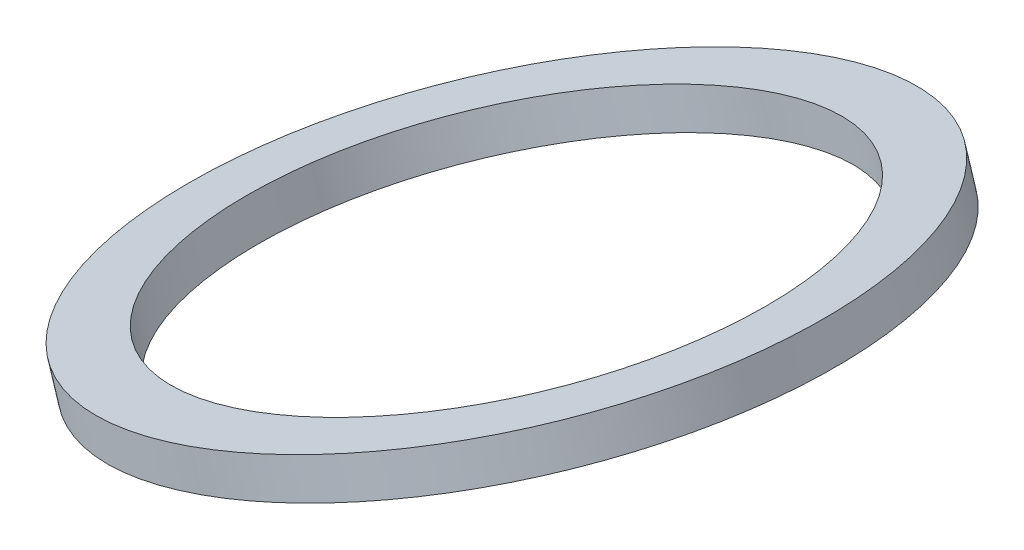
ISO-10303-21;
HEADER;
FILE_DESCRIPTION(('STEP AP214'),'2;1');
FILE_NAME('part.step','',(''),(''),'','','');
FILE_SCHEMA(('AUTOMOTIVE_DESIGN { 1 0 10303 214 1 1 1 1 }'));
ENDSEC;
DATA;
#1=APPLICATION_CONTEXT('core data for automotive mechanical design processes');
#2=APPLICATION_PROTOCOL_DEFINITION('international standard','automotive_design',2000,#1);
#3=PRODUCT_CONTEXT('',#1,'mechanical');
#4=PRODUCT('Part','Part','',(#3));
#5=PRODUCT_RELATED_PRODUCT_CATEGORY('part','',(#4));
#6=PRODUCT_DEFINITION_FORMATION('','',#4);
#7=PRODUCT_DEFINITION_CONTEXT('part definition',#1,'design');
#8=PRODUCT_DEFINITION('design','',#6,#7);
#9=PRODUCT_DEFINITION_SHAPE('','',#8);
#10=(LENGTH_UNIT() NAMED_UNIT(*) SI_UNIT(.MILLI.,.METRE.));
#11=(NAMED_UNIT(*) PLANE_ANGLE_UNIT() SI_UNIT($,.RADIAN.));
#12=(NAMED_UNIT(*) SI_UNIT($,.STERADIAN.) SOLID_ANGLE_UNIT());
#13=UNCERTAINTY_MEASURE_WITH_UNIT(LENGTH_MEASURE(1.E-05),#10,'distance_accuracy_value','');
#14=(GEOMETRIC_REPRESENTATION_CONTEXT(3) GLOBAL_UNCERTAINTY_ASSIGNED_CONTEXT((#13)) GLOBAL_UNIT_ASSIGNED_CONTEXT((#10,
#11,#12)) REPRESENTATION_CONTEXT('',''));
#15=CARTESIAN_POINT('',(0.,0.,0.));
#16=DIRECTION('',(0.,0.,1.));
#17=DIRECTION('',(1.,0.,0.));
#18=AXIS2_PLACEMENT_3D('',#15,#16,#17);
#19=CARTESIAN_POINT('',(357.677142955335,557.41885683144,0.));
#20=DIRECTION('',(-0.300714282645774,0.953714275982507,0.));
#21=DIRECTION('',(-0.953714275982507,-0.300714282645774,0.));
#22=AXIS2_PLACEMENT_3D('',#19,#20,#21);
#23=CYLINDRICAL_SURFACE('',#22,14.3000000000001);
#24=CARTESIAN_POINT('',(359.782142933856,550.742856899563,0.));
#25=DIRECTION('',(-0.300714282645774,0.953714275982507,0.));
#26=DIRECTION('',(-0.953714275982507,-0.300714282645774,0.));
#27=AXIS2_PLACEMENT_3D('',#24,#25,#26);
#28=CIRCLE('',#27,14.3000000000001);
#29=CARTESIAN_POINT('',(346.144028787306,546.442642657728,0.));
#30=VERTEX_POINT('',#29);
#31=EDGE_CURVE('E45',#30,#30,#28,.T.);
#32=CARTESIAN_POINT('',(359.180714368564,552.650285451528,0.));
#33=DIRECTION('',(-0.300714282645774,0.953714275982507,0.));
#34=DIRECTION('',(-0.953714275982507,-0.300714282645774,0.));
#35=AXIS2_PLACEMENT_3D('',#32,#33,#34);
#36=CIRCLE('',#35,14.3000000000001);
#37=CARTESIAN_POINT('',(345.542600222014,548.350071209693,0.));
#38=VERTEX_POINT('',#37);
#39=EDGE_CURVE('E10',#38,#38,#36,.T.);
#40=CARTESIAN_POINT('',(346.144028787306,546.442642657728,0.));
#41=CARTESIAN_POINT('',(346.137763906417,546.462511705144,0.));
#42=CARTESIAN_POINT('',(346.131499025529,546.482380752561,0.));
#43=CARTESIAN_POINT('',(346.118969263752,546.522118847393,0.));
#44=CARTESIAN_POINT('',(346.112704382864,546.541987894809,0.));
#45=CARTESIAN_POINT('',(346.100174621087,546.581725989642,0.));
#46=CARTESIAN_POINT('',(346.093909740198,546.601595037058,0.));
#47=CARTESIAN_POINT('',(346.081379978421,546.641333131891,0.));
#48=CARTESIAN_POINT('',(346.075115097533,546.661202179307,0.));
#49=CARTESIAN_POINT('',(346.062585335756,546.70094027414,0.));
#50=CARTESIAN_POINT('',(346.056320454867,546.720809321556,0.));
#51=CARTESIAN_POINT('',(346.043790693091,546.760547416389,0.));
#52=CARTESIAN_POINT('',(346.037525812202,546.780416463805,0.));
#53=CARTESIAN_POINT('',(346.024996050425,546.820154558638,0.));
#54=CARTESIAN_POINT('',(346.018731169537,546.840023606054,0.));
#55=CARTESIAN_POINT('',(346.00620140776,546.879761700887,0.));
#56=CARTESIAN_POINT('',(345.999936526871,546.899630748303,0.));
#57=CARTESIAN_POINT('',(345.987406765094,546.939368843136,0.));
#58=CARTESIAN_POINT('',(345.981141884206,546.959237890552,0.));
#59=CARTESIAN_POINT('',(345.968612122429,546.998975985384,0.));
#60=CARTESIAN_POINT('',(345.962347241541,547.018845032801,0.));
#61=CARTESIAN_POINT('',(345.949817479764,547.058583127633,0.));
#62=CARTESIAN_POINT('',(345.943552598875,547.07845217505,0.));
#63=CARTESIAN_POINT('',(345.931022837098,547.118190269882,0.));
#64=CARTESIAN_POINT('',(345.92475795621,547.138059317298,0.));
#65=CARTESIAN_POINT('',(345.912228194433,547.177797412131,0.));
#66=CARTESIAN_POINT('',(345.905963313545,547.197666459547,0.));
#67=CARTESIAN_POINT('',(345.893433551768,547.23740455438,0.));
#68=CARTESIAN_POINT('',(345.887168670879,547.257273601796,0.));
#69=CARTESIAN_POINT('',(345.874638909102,547.297011696629,0.));
#70=CARTESIAN_POINT('',(345.868374028214,547.316880744045,0.));
#71=CARTESIAN_POINT('',(345.855844266437,547.356618838878,0.));
#72=CARTESIAN_POINT('',(345.849579385549,547.376487886294,0.));
#73=CARTESIAN_POINT('',(345.837049623772,547.416225981127,0.));
#74=CARTESIAN_POINT('',(345.830784742883,547.436095028543,0.));
#75=CARTESIAN_POINT('',(345.818254981106,547.475833123376,0.));
#76=CARTESIAN_POINT('',(345.811990100218,547.495702170792,0.));
#77=CARTESIAN_POINT('',(345.799460338441,547.535440265625,0.));
#78=CARTESIAN_POINT('',(345.793195457552,547.555309313041,0.));
#79=CARTESIAN_POINT('',(345.780665695775,547.595047407873,0.));
#80=CARTESIAN_POINT('',(345.774400814887,547.61491645529,0.));
#81=CARTESIAN_POINT('',(345.76187105311,547.654654550122,0.));
#82=CARTESIAN_POINT('',(345.755606172222,547.674523597539,0.));
#83=CARTESIAN_POINT('',(345.743076410445,547.714261692371,0.));
#84=CARTESIAN_POINT('',(345.736811529556,547.734130739788,0.));
#85=CARTESIAN_POINT('',(345.724281767779,547.77386883462,0.));
#86=CARTESIAN_POINT('',(345.718016886891,547.793737882037,0.));
#87=CARTESIAN_POINT('',(345.705487125114,547.833475976869,0.));
#88=CARTESIAN_POINT('',(345.699222244226,547.853345024285,0.));
#89=CARTESIAN_POINT('',(345.686692482449,547.893083119118,0.));
#90=CARTESIAN_POINT('',(345.68042760156,547.912952166534,0.));
#91=CARTESIAN_POINT('',(345.667897839783,547.952690261367,0.));
#92=CARTESIAN_POINT('',(345.661632958895,547.972559308783,0.));
#93=CARTESIAN_POINT('',(345.649103197118,548.012297403616,0.));
#94=CARTESIAN_POINT('',(345.642838316229,548.032166451032,0.));
#95=CARTESIAN_POINT('',(345.630308554453,548.071904545865,0.));
#96=CARTESIAN_POINT('',(345.624043673564,548.091773593281,0.));
#97=CARTESIAN_POINT('',(345.611513911787,548.131511688114,0.));
#98=CARTESIAN_POINT('',(345.605249030899,548.15138073553,0.));
#99=CARTESIAN_POINT('',(345.592719269122,548.191118830362,0.));
#100=CARTESIAN_POINT('',(345.586454388233,548.210987877779,0.));
#101=CARTESIAN_POINT('',(345.573924626457,548.250725972611,0.));
#102=CARTESIAN_POINT('',(345.567659745568,548.270595020028,0.));
#103=CARTESIAN_POINT('',(345.555129983791,548.31033311486,0.));
#104=CARTESIAN_POINT('',(345.548865102903,548.330202162277,0.));
#105=CARTESIAN_POINT('',(345.542600222014,548.350071209693,0.));
#106=B_SPLINE_CURVE_WITH_KNOTS('',3,(#40,#41,#42,#43,#44,#45,#46,#47,#48,#49,#50,#51,#52,#53,
#54,#55,#56,#57,#58,#59,#60,#61,#62,#63,#64,#65,#66,#67,#68,#69,#70,#71,#72,#73,#74,#75,#76,#77,
#78,#79,#80,#81,#82,#83,#84,#85,#86,#87,#88,#89,#90,#91,#92,#93,#94,#95,#96,#97,#98,#99,#100,
#101,#102,#103,#104,#105),.UNSPECIFIED.,.F.,.F.,(4,2,2,2,2,2,2,2,2,2,2,2,2,2,2,2,2,2,2,2,2,2,2,
2,2,2,2,2,2,2,2,2,4),(0.,0.0624999999999352,0.124999999999976,0.187499999999911,
0.249999999999953,0.312499999999888,0.374999999999929,0.43749999999997,0.499999999999905,
0.562499999999963,0.624999999999898,0.687499999999939,0.74999999999998,0.812499999999915,
0.874999999999956,0.937499999999892,0.999999999999933,1.06249999999999,1.12499999999993,
1.18749999999997,1.2499999999999,1.31249999999994,1.37499999999998,1.43749999999992,
1.49999999999996,1.56249999999991,1.62499999999995,1.68749999999999,1.74999999999993,
1.81249999999997,1.87499999999991,1.93749999999995,1.99999999999999),.UNSPECIFIED.);
#107=EDGE_CURVE('BSEAM31',#30,#38,#106,.T.);
#108=ORIENTED_EDGE('',*,*,#31,.F.);
#109=ORIENTED_EDGE('',*,*,#39,.T.);
#110=ORIENTED_EDGE('',*,*,#107,.T.);
#111=ORIENTED_EDGE('',*,*,#107,.F.);
#112=EDGE_LOOP('',(#108,#110,#109,#111));
#113=FACE_BOUND('',#112,.T.);
#114=ADVANCED_FACE('F31',(#113),#23,.F.);
#115=CARTESIAN_POINT('',(372.818828515114,556.950499693362,0.));
#116=DIRECTION('',(0.300714282645774,-0.953714275982507,0.));
#117=DIRECTION('',(0.953714275982507,0.300714282645774,0.));
#118=AXIS2_PLACEMENT_3D('',#115,#116,#117);
#119=PLANE('',#118);
#120=ORIENTED_EDGE('',*,*,#39,.F.);
#121=EDGE_LOOP('',(#120));
#122=FACE_BOUND('',#121,.T.);
#123=CARTESIAN_POINT('',(359.180714368564,552.650285451528,0.));
#124=DIRECTION('',(-0.300714282645774,0.953714275982507,0.));
#125=DIRECTION('',(-0.953714275982507,-0.300714282645774,0.));
#126=AXIS2_PLACEMENT_3D('',#123,#124,#125);
#127=CIRCLE('',#126,17.5);
#128=CARTESIAN_POINT('',(342.49071453887,547.387785505227,0.));
#129=VERTEX_POINT('',#128);
#130=EDGE_CURVE('E37',#129,#129,#127,.T.);
#131=ORIENTED_EDGE('',*,*,#130,.T.);
#132=EDGE_LOOP('',(#131));
#133=FACE_BOUND('',#132,.T.);
#134=ADVANCED_FACE('F54',(#122,#133),#119,.F.);
#135=CARTESIAN_POINT('',(357.677142955335,557.41885683144,0.));
#136=DIRECTION('',(-0.300714282645774,0.953714275982507,0.));
#137=DIRECTION('',(-0.953714275982507,-0.300714282645774,0.));
#138=AXIS2_PLACEMENT_3D('',#135,#136,#137);
#139=CYLINDRICAL_SURFACE('',#138,17.5);
#140=CARTESIAN_POINT('',(359.782142933856,550.742856899563,0.));
#141=DIRECTION('',(-0.300714282645774,0.953714275982507,0.));
#142=DIRECTION('',(-0.953714275982507,-0.300714282645774,0.));
#143=AXIS2_PLACEMENT_3D('',#140,#141,#142);
#144=CIRCLE('',#143,17.5);
#145=CARTESIAN_POINT('',(343.092143104162,545.480356953262,0.));
#146=VERTEX_POINT('',#145);
#147=EDGE_CURVE('E41',#146,#146,#144,.T.);
#148=CARTESIAN_POINT('',(342.49071453887,547.387785505227,0.));
#149=CARTESIAN_POINT('',(342.496979419759,547.36791645781,0.));
#150=CARTESIAN_POINT('',(342.503244300647,547.348047410394,0.));
#151=CARTESIAN_POINT('',(342.515774062424,547.308309315561,0.));
#152=CARTESIAN_POINT('',(342.522038943313,547.288440268145,0.));
#153=CARTESIAN_POINT('',(342.534568705089,547.248702173312,0.));
#154=CARTESIAN_POINT('',(342.540833585978,547.228833125896,0.));
#155=CARTESIAN_POINT('',(342.553363347755,547.189095031064,0.));
#156=CARTESIAN_POINT('',(342.559628228643,547.169225983647,0.));
#157=CARTESIAN_POINT('',(342.57215799042,547.129487888815,0.));
#158=CARTESIAN_POINT('',(342.578422871309,547.109618841398,0.));
#159=CARTESIAN_POINT('',(342.590952633086,547.069880746566,0.));
#160=CARTESIAN_POINT('',(342.597217513974,547.050011699149,0.));
#161=CARTESIAN_POINT('',(342.609747275751,547.010273604317,0.));
#162=CARTESIAN_POINT('',(342.616012156639,546.990404556901,0.));
#163=CARTESIAN_POINT('',(342.628541918416,546.950666462068,0.));
#164=CARTESIAN_POINT('',(342.634806799305,546.930797414652,0.));
#165=CARTESIAN_POINT('',(342.647336561082,546.891059319819,0.));
#166=CARTESIAN_POINT('',(342.65360144197,546.871190272403,0.));
#167=CARTESIAN_POINT('',(342.666131203747,546.83145217757,0.));
#168=CARTESIAN_POINT('',(342.672396084635,546.811583130154,0.));
#169=CARTESIAN_POINT('',(342.684925846412,546.771845035321,0.));
#170=CARTESIAN_POINT('',(342.691190727301,546.751975987905,0.));
#171=CARTESIAN_POINT('',(342.703720489078,546.712237893072,0.));
#172=CARTESIAN_POINT('',(342.709985369966,546.692368845656,0.));
#173=CARTESIAN_POINT('',(342.722515131743,546.652630750823,0.));
#174=CARTESIAN_POINT('',(342.728780012632,546.632761703407,0.));
#175=CARTESIAN_POINT('',(342.741309774408,546.593023608574,0.));
#176=CARTESIAN_POINT('',(342.747574655297,546.573154561158,0.));
#177=CARTESIAN_POINT('',(342.760104417074,546.533416466326,0.));
#178=CARTESIAN_POINT('',(342.766369297962,546.513547418909,0.));
#179=CARTESIAN_POINT('',(342.778899059739,546.473809324077,0.));
#180=CARTESIAN_POINT('',(342.785163940628,546.45394027666,0.));
#181=CARTESIAN_POINT('',(342.797693702405,546.414202181828,0.));
#182=CARTESIAN_POINT('',(342.803958583293,546.394333134411,0.));
#183=CARTESIAN_POINT('',(342.81648834507,546.354595039579,0.));
#184=CARTESIAN_POINT('',(342.822753225958,546.334725992162,0.));
#185=CARTESIAN_POINT('',(342.835282987735,546.29498789733,0.));
#186=CARTESIAN_POINT('',(342.841547868624,546.275118849914,0.));
#187=CARTESIAN_POINT('',(342.854077630401,546.235380755081,0.));
#188=CARTESIAN_POINT('',(342.860342511289,546.215511707665,0.));
#189=CARTESIAN_POINT('',(342.872872273066,546.175773612832,0.));
#190=CARTESIAN_POINT('',(342.879137153954,546.155904565416,0.));
#191=CARTESIAN_POINT('',(342.891666915731,546.116166470583,0.));
#192=CARTESIAN_POINT('',(342.89793179662,546.096297423167,0.));
#193=CARTESIAN_POINT('',(342.910461558397,546.056559328334,0.));
#194=CARTESIAN_POINT('',(342.916726439285,546.036690280918,0.));
#195=CARTESIAN_POINT('',(342.929256201062,545.996952186085,0.));
#196=CARTESIAN_POINT('',(342.935521081951,545.977083138669,0.));
#197=CARTESIAN_POINT('',(342.948050843727,545.937345043837,0.));
#198=CARTESIAN_POINT('',(342.954315724616,545.91747599642,0.));
#199=CARTESIAN_POINT('',(342.966845486393,545.877737901588,0.));
#200=CARTESIAN_POINT('',(342.973110367281,545.857868854171,0.));
#201=CARTESIAN_POINT('',(342.985640129058,545.818130759339,0.));
#202=CARTESIAN_POINT('',(342.991905009947,545.798261711922,0.));
#203=CARTESIAN_POINT('',(343.004434771723,545.75852361709,0.));
#204=CARTESIAN_POINT('',(343.010699652612,545.738654569673,0.));
#205=CARTESIAN_POINT('',(343.023229414389,545.698916474841,0.));
#206=CARTESIAN_POINT('',(343.029494295277,545.679047427425,0.));
#207=CARTESIAN_POINT('',(343.042024057054,545.639309332592,0.));
#208=CARTESIAN_POINT('',(343.048288937943,545.619440285176,0.));
#209=CARTESIAN_POINT('',(343.06081869972,545.579702190343,0.));
#210=CARTESIAN_POINT('',(343.067083580608,545.559833142927,0.));
#211=CARTESIAN_POINT('',(343.079613342385,545.520095048094,0.));
#212=CARTESIAN_POINT('',(343.085878223273,545.500226000678,0.));
#213=CARTESIAN_POINT('',(343.092143104162,545.480356953262,0.));
#214=B_SPLINE_CURVE_WITH_KNOTS('',3,(#148,#149,#150,#151,#152,#153,#154,#155,#156,#157,#158,
#159,#160,#161,#162,#163,#164,#165,#166,#167,#168,#169,#170,#171,#172,#173,#174,#175,#176,#177,
#178,#179,#180,#181,#182,#183,#184,#185,#186,#187,#188,#189,#190,#191,#192,#193,#194,#195,#196,
#197,#198,#199,#200,#201,#202,#203,#204,#205,#206,#207,#208,#209,#210,#211,#212,#213),
.UNSPECIFIED.,.F.,.F.,(4,2,2,2,2,2,2,2,2,2,2,2,2,2,2,2,2,2,2,2,2,2,2,2,2,2,2,2,2,2,2,2,4),(0.,
0.0625000000000411,0.125000000000082,0.187500000000017,0.250000000000058,0.312499999999994,
0.375000000000035,0.437500000000076,0.500000000000028,0.562500000000069,0.625000000000004,
0.687500000000045,0.750000000000086,0.812500000000021,0.875000000000062,0.937499999999998,
1.00000000000006,1.0625000000001,1.12500000000003,1.18750000000007,1.25000000000001,
1.31250000000005,1.37500000000009,1.43750000000003,1.50000000000008,1.56250000000002,
1.62500000000006,1.6875000000001,1.75000000000004,1.81250000000008,1.87500000000001,
1.93750000000005,1.99999999999999),.UNSPECIFIED.);
#215=EDGE_CURVE('BSEAM58',#129,#146,#214,.T.);
#216=ORIENTED_EDGE('',*,*,#130,.F.);
#217=ORIENTED_EDGE('',*,*,#147,.T.);
#218=ORIENTED_EDGE('',*,*,#215,.T.);
#219=ORIENTED_EDGE('',*,*,#215,.F.);
#220=EDGE_LOOP('',(#216,#218,#217,#219));
#221=FACE_BOUND('',#220,.T.);
#222=ADVANCED_FACE('F58',(#221),#139,.T.);
#223=CARTESIAN_POINT('',(376.47214276355,556.005356845864,0.));
#224=DIRECTION('',(-0.300714282645774,0.953714275982507,0.));
#225=DIRECTION('',(-0.953714275982507,-0.300714282645774,0.));
#226=AXIS2_PLACEMENT_3D('',#223,#224,#225);
#227=PLANE('',#226);
#228=ORIENTED_EDGE('',*,*,#147,.F.);
#229=EDGE_LOOP('',(#228));
#230=FACE_BOUND('',#229,.T.);
#231=ORIENTED_EDGE('',*,*,#31,.T.);
#232=EDGE_LOOP('',(#231));
#233=FACE_BOUND('',#232,.T.);
#234=ADVANCED_FACE('F51',(#230,#233),#227,.F.);
#235=CLOSED_SHELL('',(#114,#134,#222,#234));
#236=MANIFOLD_SOLID_BREP('B2',#235);
#237=ADVANCED_BREP_SHAPE_REPRESENTATION('',(#18,#236),#14);
#238=SHAPE_DEFINITION_REPRESENTATION(#9,#237);
ENDSEC;
END-ISO-10303-21;
